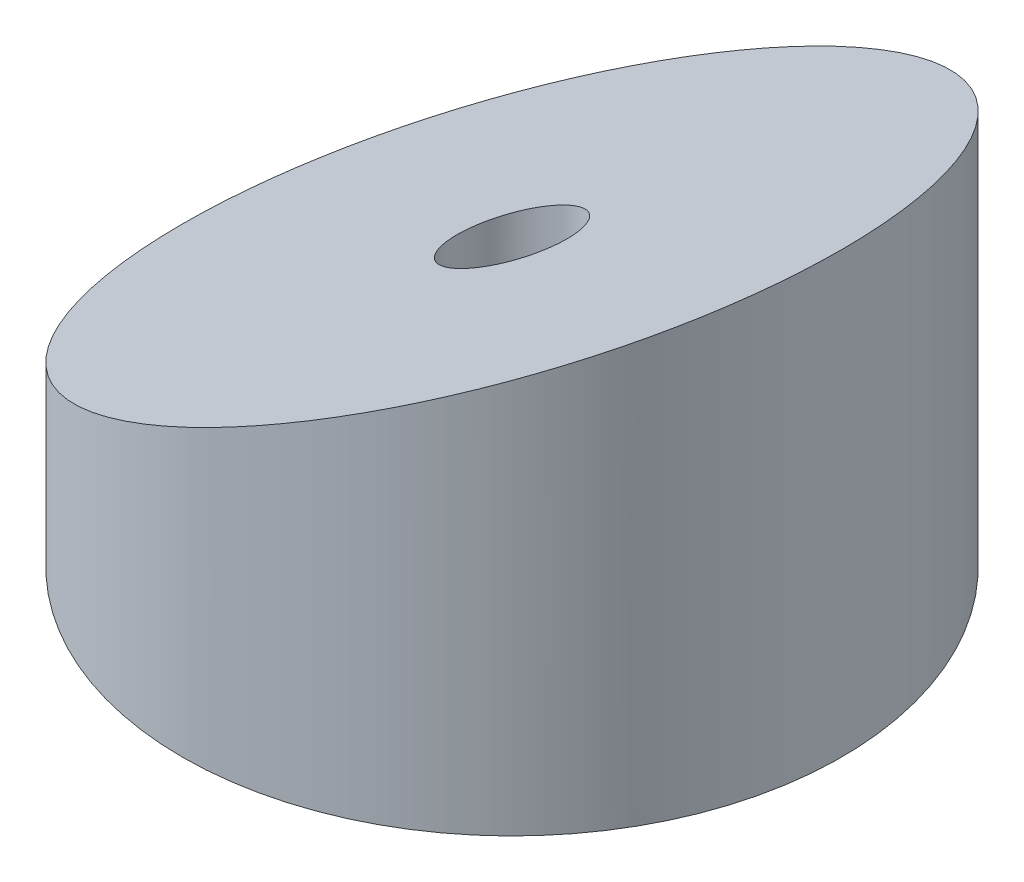
ISO-10303-21;
HEADER;
FILE_DESCRIPTION(('STEP AP214'),'2;1');
FILE_NAME('part.step','',(''),(''),'','','');
FILE_SCHEMA(('AUTOMOTIVE_DESIGN { 1 0 10303 214 1 1 1 1 }'));
ENDSEC;
DATA;
#1=APPLICATION_CONTEXT('core data for automotive mechanical design processes');
#2=APPLICATION_PROTOCOL_DEFINITION('international standard','automotive_design',2000,#1);
#3=PRODUCT_CONTEXT('',#1,'mechanical');
#4=PRODUCT('Part','Part','',(#3));
#5=PRODUCT_RELATED_PRODUCT_CATEGORY('part','',(#4));
#6=PRODUCT_DEFINITION_FORMATION('','',#4);
#7=PRODUCT_DEFINITION_CONTEXT('part definition',#1,'design');
#8=PRODUCT_DEFINITION('design','',#6,#7);
#9=PRODUCT_DEFINITION_SHAPE('','',#8);
#10=(LENGTH_UNIT() NAMED_UNIT(*) SI_UNIT(.MILLI.,.METRE.));
#11=(NAMED_UNIT(*) PLANE_ANGLE_UNIT() SI_UNIT($,.RADIAN.));
#12=(NAMED_UNIT(*) SI_UNIT($,.STERADIAN.) SOLID_ANGLE_UNIT());
#13=UNCERTAINTY_MEASURE_WITH_UNIT(LENGTH_MEASURE(1.E-05),#10,'distance_accuracy_value','');
#14=(GEOMETRIC_REPRESENTATION_CONTEXT(3) GLOBAL_UNCERTAINTY_ASSIGNED_CONTEXT((#13)) GLOBAL_UNIT_ASSIGNED_CONTEXT((#10,
#11,#12)) REPRESENTATION_CONTEXT('',''));
#15=CARTESIAN_POINT('',(0.,0.,0.));
#16=DIRECTION('',(0.,0.,1.));
#17=DIRECTION('',(1.,0.,0.));
#18=AXIS2_PLACEMENT_3D('',#15,#16,#17);
#19=CARTESIAN_POINT('',(0.,80.,0.));
#20=DIRECTION('',(0.,-1.,0.));
#21=DIRECTION('',(0.,0.,-1.));
#22=AXIS2_PLACEMENT_3D('',#19,#20,#21);
#23=CYLINDRICAL_SURFACE('',#22,120.);
#24=CARTESIAN_POINT('',(0.,-80.,0.));
#25=DIRECTION('',(0.,1.,0.));
#26=DIRECTION('',(0.,0.,1.));
#27=AXIS2_PLACEMENT_3D('',#24,#25,#26);
#28=CIRCLE('',#27,120.);
#29=CARTESIAN_POINT('',(0.,-80.,120.));
#30=VERTEX_POINT('',#29);
#31=EDGE_CURVE('E10',#30,#30,#28,.T.);
#32=ORIENTED_EDGE('',*,*,#31,.T.);
#33=EDGE_LOOP('',(#32));
#34=FACE_BOUND('',#33,.T.);
#35=CARTESIAN_POINT('',(0.,24.0430810214011,0.));
#36=DIRECTION('',(-0.422618261740694,0.906307787036652,0.));
#37=DIRECTION('',(-0.906307787036653,-0.422618261740694,0.));
#38=AXIS2_PLACEMENT_3D('',#35,#36,#37);
#39=ELLIPSE('',#38,132.405350275499,120.);
#40=CARTESIAN_POINT('',(-120.,-31.9138379571978,0.));
#41=VERTEX_POINT('',#40);
#42=EDGE_CURVE('E42',#41,#41,#39,.T.);
#43=ORIENTED_EDGE('',*,*,#42,.F.);
#44=EDGE_LOOP('',(#43));
#45=FACE_BOUND('',#44,.T.);
#46=ADVANCED_FACE('F31',(#34,#45),#23,.T.);
#47=CARTESIAN_POINT('',(0.,80.,0.));
#48=DIRECTION('',(0.,-1.,0.));
#49=DIRECTION('',(0.,0.,-1.));
#50=AXIS2_PLACEMENT_3D('',#47,#48,#49);
#51=CYLINDRICAL_SURFACE('',#50,20.);
#52=CARTESIAN_POINT('',(0.,-80.,0.));
#53=DIRECTION('',(0.,1.,0.));
#54=DIRECTION('',(0.,0.,1.));
#55=AXIS2_PLACEMENT_3D('',#52,#53,#54);
#56=CIRCLE('',#55,20.);
#57=CARTESIAN_POINT('',(0.,-80.,20.));
#58=VERTEX_POINT('',#57);
#59=EDGE_CURVE('E38',#58,#58,#56,.T.);
#60=ORIENTED_EDGE('',*,*,#59,.F.);
#61=EDGE_LOOP('',(#60));
#62=FACE_BOUND('',#61,.T.);
#63=CARTESIAN_POINT('',(0.,24.0430810214011,0.));
#64=DIRECTION('',(-0.422618261740694,0.906307787036652,0.));
#65=DIRECTION('',(-0.906307787036653,-0.422618261740694,0.));
#66=AXIS2_PLACEMENT_3D('',#63,#64,#65);
#67=ELLIPSE('',#66,22.0675583792498,20.);
#68=CARTESIAN_POINT('',(-20.,14.7169278583013,0.));
#69=VERTEX_POINT('',#68);
#70=EDGE_CURVE('E34',#69,#69,#67,.T.);
#71=ORIENTED_EDGE('',*,*,#70,.T.);
#72=EDGE_LOOP('',(#71));
#73=FACE_BOUND('',#72,.T.);
#74=ADVANCED_FACE('F51',(#62,#73),#51,.F.);
#75=CARTESIAN_POINT('',(0.,-80.,0.));
#76=DIRECTION('',(0.,1.,0.));
#77=DIRECTION('',(0.,0.,1.));
#78=AXIS2_PLACEMENT_3D('',#75,#76,#77);
#79=PLANE('',#78);
#80=ORIENTED_EDGE('',*,*,#31,.F.);
#81=EDGE_LOOP('',(#80));
#82=FACE_BOUND('',#81,.T.);
#83=ORIENTED_EDGE('',*,*,#59,.T.);
#84=EDGE_LOOP('',(#83));
#85=FACE_BOUND('',#84,.T.);
#86=ADVANCED_FACE('F55',(#82,#85),#79,.F.);
#87=CARTESIAN_POINT('',(120.,80.,-120.));
#88=DIRECTION('',(-0.422618261740694,0.906307787036652,0.));
#89=DIRECTION('',(-0.906307787036653,-0.422618261740694,0.));
#90=AXIS2_PLACEMENT_3D('',#87,#88,#89);
#91=PLANE('',#90);
#92=ORIENTED_EDGE('',*,*,#70,.F.);
#93=EDGE_LOOP('',(#92));
#94=FACE_BOUND('',#93,.T.);
#95=ORIENTED_EDGE('',*,*,#42,.T.);
#96=EDGE_LOOP('',(#95));
#97=FACE_BOUND('',#96,.T.);
#98=ADVANCED_FACE('F53',(#94,#97),#91,.T.);
#99=CLOSED_SHELL('',(#46,#74,#86,#98));
#100=MANIFOLD_SOLID_BREP('B2',#99);
#101=ADVANCED_BREP_SHAPE_REPRESENTATION('',(#18,#100),#14);
#102=SHAPE_DEFINITION_REPRESENTATION(#9,#101);
ENDSEC;
END-ISO-10303-21;
